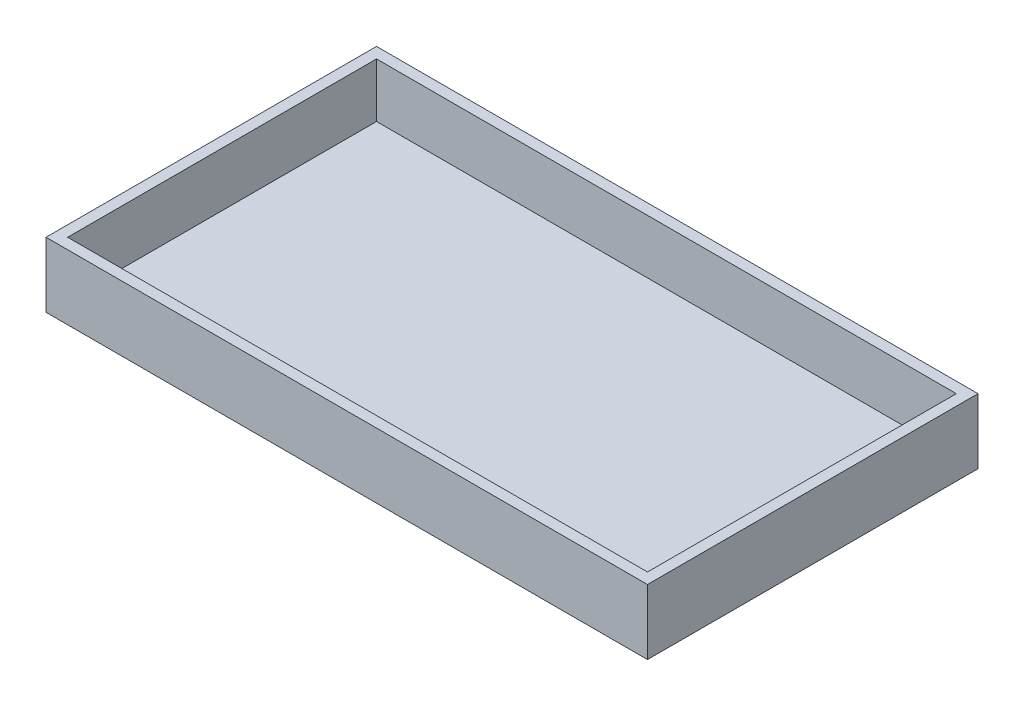
ISO-10303-21;
HEADER;
FILE_DESCRIPTION(('STEP AP214'),'2;1');
FILE_NAME('part.step','',(''),(''),'','','');
FILE_SCHEMA(('AUTOMOTIVE_DESIGN { 1 0 10303 214 1 1 1 1 }'));
ENDSEC;
DATA;
#1=APPLICATION_CONTEXT('core data for automotive mechanical design processes');
#2=APPLICATION_PROTOCOL_DEFINITION('international standard','automotive_design',2000,#1);
#3=PRODUCT_CONTEXT('',#1,'mechanical');
#4=PRODUCT('Part','Part','',(#3));
#5=PRODUCT_RELATED_PRODUCT_CATEGORY('part','',(#4));
#6=PRODUCT_DEFINITION_FORMATION('','',#4);
#7=PRODUCT_DEFINITION_CONTEXT('part definition',#1,'design');
#8=PRODUCT_DEFINITION('design','',#6,#7);
#9=PRODUCT_DEFINITION_SHAPE('','',#8);
#10=(LENGTH_UNIT() NAMED_UNIT(*) SI_UNIT(.MILLI.,.METRE.));
#11=(NAMED_UNIT(*) PLANE_ANGLE_UNIT() SI_UNIT($,.RADIAN.));
#12=(NAMED_UNIT(*) SI_UNIT($,.STERADIAN.) SOLID_ANGLE_UNIT());
#13=UNCERTAINTY_MEASURE_WITH_UNIT(LENGTH_MEASURE(1.E-05),#10,'distance_accuracy_value','');
#14=(GEOMETRIC_REPRESENTATION_CONTEXT(3) GLOBAL_UNCERTAINTY_ASSIGNED_CONTEXT((#13)) GLOBAL_UNIT_ASSIGNED_CONTEXT((#10,
#11,#12)) REPRESENTATION_CONTEXT('',''));
#15=CARTESIAN_POINT('',(0.,0.,0.));
#16=DIRECTION('',(0.,0.,1.));
#17=DIRECTION('',(1.,0.,0.));
#18=AXIS2_PLACEMENT_3D('',#15,#16,#17);
#19=CARTESIAN_POINT('',(-2.,-10.,0.));
#20=DIRECTION('',(-1.,0.,0.));
#21=DIRECTION('',(0.,0.,1.));
#22=AXIS2_PLACEMENT_3D('',#19,#20,#21);
#23=PLANE('',#22);
#24=DIRECTION('',(0.,0.,1.));
#25=VECTOR('',#24,1.);
#26=CARTESIAN_POINT('',(-2.,0.,0.));
#27=LINE('',#26,#25);
#28=CARTESIAN_POINT('',(-2.00000000000001,0.,-59.));
#29=VERTEX_POINT('',#28);
#30=CARTESIAN_POINT('',(-2.,0.,2.));
#31=VERTEX_POINT('',#30);
#32=EDGE_CURVE('E176',#29,#31,#27,.T.);
#33=ORIENTED_EDGE('',*,*,#32,.F.);
#34=DIRECTION('',(0.,1.,0.));
#35=VECTOR('',#34,1.);
#36=CARTESIAN_POINT('',(-2.00000000000001,-10.,-59.));
#37=LINE('',#36,#35);
#38=CARTESIAN_POINT('',(-2.00000000000001,-12.,-59.));
#39=VERTEX_POINT('',#38);
#40=EDGE_CURVE('E12',#39,#29,#37,.T.);
#41=ORIENTED_EDGE('',*,*,#40,.F.);
#42=DIRECTION('',(0.,0.,-1.));
#43=VECTOR('',#42,1.);
#44=CARTESIAN_POINT('',(-2.00000000000001,-12.,-59.));
#45=LINE('',#44,#43);
#46=CARTESIAN_POINT('',(-2.,-12.,2.));
#47=VERTEX_POINT('',#46);
#48=EDGE_CURVE('E143',#47,#39,#45,.T.);
#49=ORIENTED_EDGE('',*,*,#48,.F.);
#50=DIRECTION('',(0.,1.,0.));
#51=VECTOR('',#50,1.);
#52=CARTESIAN_POINT('',(-2.,-10.,2.));
#53=LINE('',#52,#51);
#54=EDGE_CURVE('E64',#47,#31,#53,.T.);
#55=ORIENTED_EDGE('',*,*,#54,.T.);
#56=EDGE_LOOP('',(#33,#41,#49,#55));
#57=FACE_BOUND('',#56,.T.);
#58=ADVANCED_FACE('F61',(#57),#23,.T.);
#59=CARTESIAN_POINT('',(0.,-10.,-59.));
#60=DIRECTION('',(0.,0.,-1.));
#61=DIRECTION('',(-1.,0.,0.));
#62=AXIS2_PLACEMENT_3D('',#59,#60,#61);
#63=PLANE('',#62);
#64=DIRECTION('',(-1.,0.,0.));
#65=VECTOR('',#64,1.);
#66=CARTESIAN_POINT('',(0.,0.,-59.));
#67=LINE('',#66,#65);
#68=CARTESIAN_POINT('',(109.,0.,-59.));
#69=VERTEX_POINT('',#68);
#70=EDGE_CURVE('E187',#69,#29,#67,.T.);
#71=ORIENTED_EDGE('',*,*,#70,.F.);
#72=DIRECTION('',(0.,1.,0.));
#73=VECTOR('',#72,1.);
#74=CARTESIAN_POINT('',(109.,-10.,-59.));
#75=LINE('',#74,#73);
#76=CARTESIAN_POINT('',(109.,-12.,-59.));
#77=VERTEX_POINT('',#76);
#78=EDGE_CURVE('E69',#77,#69,#75,.T.);
#79=ORIENTED_EDGE('',*,*,#78,.F.);
#80=DIRECTION('',(1.,0.,0.));
#81=VECTOR('',#80,1.);
#82=CARTESIAN_POINT('',(109.,-12.,-59.));
#83=LINE('',#82,#81);
#84=EDGE_CURVE('E148',#39,#77,#83,.T.);
#85=ORIENTED_EDGE('',*,*,#84,.F.);
#86=ORIENTED_EDGE('',*,*,#40,.T.);
#87=EDGE_LOOP('',(#71,#79,#85,#86));
#88=FACE_BOUND('',#87,.T.);
#89=ADVANCED_FACE('F194',(#88),#63,.T.);
#90=CARTESIAN_POINT('',(109.,-10.,0.));
#91=DIRECTION('',(1.,0.,0.));
#92=DIRECTION('',(0.,0.,-1.));
#93=AXIS2_PLACEMENT_3D('',#90,#91,#92);
#94=PLANE('',#93);
#95=DIRECTION('',(0.,0.,-1.));
#96=VECTOR('',#95,1.);
#97=CARTESIAN_POINT('',(109.,0.,0.));
#98=LINE('',#97,#96);
#99=CARTESIAN_POINT('',(109.,0.,2.));
#100=VERTEX_POINT('',#99);
#101=EDGE_CURVE('E133',#100,#69,#98,.T.);
#102=ORIENTED_EDGE('',*,*,#101,.F.);
#103=DIRECTION('',(0.,1.,0.));
#104=VECTOR('',#103,1.);
#105=CARTESIAN_POINT('',(109.,-10.,2.));
#106=LINE('',#105,#104);
#107=CARTESIAN_POINT('',(109.,-12.,2.));
#108=VERTEX_POINT('',#107);
#109=EDGE_CURVE('E127',#108,#100,#106,.T.);
#110=ORIENTED_EDGE('',*,*,#109,.F.);
#111=DIRECTION('',(0.,0.,1.));
#112=VECTOR('',#111,1.);
#113=CARTESIAN_POINT('',(109.,-12.,2.));
#114=LINE('',#113,#112);
#115=EDGE_CURVE('E131',#77,#108,#114,.T.);
#116=ORIENTED_EDGE('',*,*,#115,.F.);
#117=ORIENTED_EDGE('',*,*,#78,.T.);
#118=EDGE_LOOP('',(#102,#110,#116,#117));
#119=FACE_BOUND('',#118,.T.);
#120=ADVANCED_FACE('F129',(#119),#94,.T.);
#121=CARTESIAN_POINT('',(0.,-10.,2.));
#122=DIRECTION('',(0.,0.,1.));
#123=DIRECTION('',(1.,0.,0.));
#124=AXIS2_PLACEMENT_3D('',#121,#122,#123);
#125=PLANE('',#124);
#126=DIRECTION('',(1.,0.,0.));
#127=VECTOR('',#126,1.);
#128=CARTESIAN_POINT('',(0.,0.,2.));
#129=LINE('',#128,#127);
#130=EDGE_CURVE('E184',#31,#100,#129,.T.);
#131=ORIENTED_EDGE('',*,*,#130,.F.);
#132=ORIENTED_EDGE('',*,*,#54,.F.);
#133=DIRECTION('',(-1.,0.,0.));
#134=VECTOR('',#133,1.);
#135=CARTESIAN_POINT('',(-2.,-12.,2.));
#136=LINE('',#135,#134);
#137=EDGE_CURVE('E138',#108,#47,#136,.T.);
#138=ORIENTED_EDGE('',*,*,#137,.F.);
#139=ORIENTED_EDGE('',*,*,#109,.T.);
#140=EDGE_LOOP('',(#131,#132,#138,#139));
#141=FACE_BOUND('',#140,.T.);
#142=ADVANCED_FACE('F139',(#141),#125,.T.);
#143=CARTESIAN_POINT('',(0.,0.,0.));
#144=DIRECTION('',(0.,1.,0.));
#145=DIRECTION('',(0.,0.,1.));
#146=AXIS2_PLACEMENT_3D('',#143,#144,#145);
#147=PLANE('',#146);
#148=DIRECTION('',(0.,0.,1.));
#149=VECTOR('',#148,1.);
#150=CARTESIAN_POINT('',(0.,0.,0.));
#151=LINE('',#150,#149);
#152=CARTESIAN_POINT('',(0.,0.,-57.));
#153=VERTEX_POINT('',#152);
#154=CARTESIAN_POINT('',(0.,0.,0.));
#155=VERTEX_POINT('',#154);
#156=EDGE_CURVE('E85',#153,#155,#151,.T.);
#157=ORIENTED_EDGE('',*,*,#156,.F.);
#158=DIRECTION('',(-1.,0.,0.));
#159=VECTOR('',#158,1.);
#160=CARTESIAN_POINT('',(0.,0.,-57.));
#161=LINE('',#160,#159);
#162=CARTESIAN_POINT('',(107.,0.,-57.));
#163=VERTEX_POINT('',#162);
#164=EDGE_CURVE('E157',#163,#153,#161,.T.);
#165=ORIENTED_EDGE('',*,*,#164,.F.);
#166=DIRECTION('',(0.,0.,-1.));
#167=VECTOR('',#166,1.);
#168=CARTESIAN_POINT('',(107.,0.,0.));
#169=LINE('',#168,#167);
#170=CARTESIAN_POINT('',(107.,0.,0.));
#171=VERTEX_POINT('',#170);
#172=EDGE_CURVE('E169',#171,#163,#169,.T.);
#173=ORIENTED_EDGE('',*,*,#172,.F.);
#174=DIRECTION('',(1.,0.,0.));
#175=VECTOR('',#174,1.);
#176=CARTESIAN_POINT('',(0.,0.,0.));
#177=LINE('',#176,#175);
#178=EDGE_CURVE('E166',#155,#171,#177,.T.);
#179=ORIENTED_EDGE('',*,*,#178,.F.);
#180=EDGE_LOOP('',(#157,#165,#173,#179));
#181=FACE_BOUND('',#180,.T.);
#182=ORIENTED_EDGE('',*,*,#32,.T.);
#183=ORIENTED_EDGE('',*,*,#130,.T.);
#184=ORIENTED_EDGE('',*,*,#101,.T.);
#185=ORIENTED_EDGE('',*,*,#70,.T.);
#186=EDGE_LOOP('',(#182,#183,#184,#185));
#187=FACE_BOUND('',#186,.T.);
#188=ADVANCED_FACE('F193',(#181,#187),#147,.T.);
#189=CARTESIAN_POINT('',(0.,-10.,0.));
#190=DIRECTION('',(-1.,0.,0.));
#191=DIRECTION('',(0.,0.,1.));
#192=AXIS2_PLACEMENT_3D('',#189,#190,#191);
#193=PLANE('',#192);
#194=ORIENTED_EDGE('',*,*,#156,.T.);
#195=DIRECTION('',(0.,1.,0.));
#196=VECTOR('',#195,1.);
#197=CARTESIAN_POINT('',(0.,-10.,0.));
#198=LINE('',#197,#196);
#199=CARTESIAN_POINT('',(0.,-10.,0.));
#200=VERTEX_POINT('',#199);
#201=EDGE_CURVE('E164',#200,#155,#198,.T.);
#202=ORIENTED_EDGE('',*,*,#201,.F.);
#203=DIRECTION('',(0.,0.,1.));
#204=VECTOR('',#203,1.);
#205=CARTESIAN_POINT('',(0.,-10.,0.));
#206=LINE('',#205,#204);
#207=CARTESIAN_POINT('',(0.,-10.,-57.));
#208=VERTEX_POINT('',#207);
#209=EDGE_CURVE('E153',#208,#200,#206,.T.);
#210=ORIENTED_EDGE('',*,*,#209,.F.);
#211=DIRECTION('',(0.,1.,0.));
#212=VECTOR('',#211,1.);
#213=CARTESIAN_POINT('',(0.,-10.,-57.));
#214=LINE('',#213,#212);
#215=EDGE_CURVE('E174',#208,#153,#214,.T.);
#216=ORIENTED_EDGE('',*,*,#215,.T.);
#217=EDGE_LOOP('',(#194,#202,#210,#216));
#218=FACE_BOUND('',#217,.T.);
#219=ADVANCED_FACE('F212',(#218),#193,.F.);
#220=CARTESIAN_POINT('',(0.,-10.,-57.));
#221=DIRECTION('',(0.,0.,-1.));
#222=DIRECTION('',(-1.,0.,0.));
#223=AXIS2_PLACEMENT_3D('',#220,#221,#222);
#224=PLANE('',#223);
#225=ORIENTED_EDGE('',*,*,#164,.T.);
#226=ORIENTED_EDGE('',*,*,#215,.F.);
#227=DIRECTION('',(-1.,0.,0.));
#228=VECTOR('',#227,1.);
#229=CARTESIAN_POINT('',(0.,-10.,-57.));
#230=LINE('',#229,#228);
#231=CARTESIAN_POINT('',(107.,-10.,-57.));
#232=VERTEX_POINT('',#231);
#233=EDGE_CURVE('E161',#232,#208,#230,.T.);
#234=ORIENTED_EDGE('',*,*,#233,.F.);
#235=DIRECTION('',(0.,1.,0.));
#236=VECTOR('',#235,1.);
#237=CARTESIAN_POINT('',(107.,-10.,-57.));
#238=LINE('',#237,#236);
#239=EDGE_CURVE('E177',#232,#163,#238,.T.);
#240=ORIENTED_EDGE('',*,*,#239,.T.);
#241=EDGE_LOOP('',(#225,#226,#234,#240));
#242=FACE_BOUND('',#241,.T.);
#243=ADVANCED_FACE('F217',(#242),#224,.F.);
#244=CARTESIAN_POINT('',(107.,-10.,0.));
#245=DIRECTION('',(1.,0.,0.));
#246=DIRECTION('',(0.,0.,-1.));
#247=AXIS2_PLACEMENT_3D('',#244,#245,#246);
#248=PLANE('',#247);
#249=ORIENTED_EDGE('',*,*,#172,.T.);
#250=ORIENTED_EDGE('',*,*,#239,.F.);
#251=DIRECTION('',(0.,0.,-1.));
#252=VECTOR('',#251,1.);
#253=CARTESIAN_POINT('',(107.,-10.,0.));
#254=LINE('',#253,#252);
#255=CARTESIAN_POINT('',(107.,-10.,0.));
#256=VERTEX_POINT('',#255);
#257=EDGE_CURVE('E77',#256,#232,#254,.T.);
#258=ORIENTED_EDGE('',*,*,#257,.F.);
#259=DIRECTION('',(0.,1.,0.));
#260=VECTOR('',#259,1.);
#261=CARTESIAN_POINT('',(107.,-10.,0.));
#262=LINE('',#261,#260);
#263=EDGE_CURVE('E179',#256,#171,#262,.T.);
#264=ORIENTED_EDGE('',*,*,#263,.T.);
#265=EDGE_LOOP('',(#249,#250,#258,#264));
#266=FACE_BOUND('',#265,.T.);
#267=ADVANCED_FACE('F228',(#266),#248,.F.);
#268=CARTESIAN_POINT('',(0.,-10.,0.));
#269=DIRECTION('',(0.,0.,1.));
#270=DIRECTION('',(1.,0.,0.));
#271=AXIS2_PLACEMENT_3D('',#268,#269,#270);
#272=PLANE('',#271);
#273=ORIENTED_EDGE('',*,*,#178,.T.);
#274=ORIENTED_EDGE('',*,*,#263,.F.);
#275=DIRECTION('',(1.,0.,0.));
#276=VECTOR('',#275,1.);
#277=CARTESIAN_POINT('',(0.,-10.,0.));
#278=LINE('',#277,#276);
#279=EDGE_CURVE('E156',#200,#256,#278,.T.);
#280=ORIENTED_EDGE('',*,*,#279,.F.);
#281=ORIENTED_EDGE('',*,*,#201,.T.);
#282=EDGE_LOOP('',(#273,#274,#280,#281));
#283=FACE_BOUND('',#282,.T.);
#284=ADVANCED_FACE('F222',(#283),#272,.F.);
#285=CARTESIAN_POINT('',(0.,-10.,0.));
#286=DIRECTION('',(0.,1.,0.));
#287=DIRECTION('',(0.,0.,1.));
#288=AXIS2_PLACEMENT_3D('',#285,#286,#287);
#289=PLANE('',#288);
#290=ORIENTED_EDGE('',*,*,#257,.T.);
#291=ORIENTED_EDGE('',*,*,#233,.T.);
#292=ORIENTED_EDGE('',*,*,#209,.T.);
#293=ORIENTED_EDGE('',*,*,#279,.T.);
#294=EDGE_LOOP('',(#290,#291,#292,#293));
#295=FACE_BOUND('',#294,.T.);
#296=ADVANCED_FACE('F226',(#295),#289,.T.);
#297=CARTESIAN_POINT('',(0.,-12.,0.));
#298=DIRECTION('',(0.,1.,0.));
#299=DIRECTION('',(0.,0.,1.));
#300=AXIS2_PLACEMENT_3D('',#297,#298,#299);
#301=PLANE('',#300);
#302=ORIENTED_EDGE('',*,*,#115,.T.);
#303=ORIENTED_EDGE('',*,*,#137,.T.);
#304=ORIENTED_EDGE('',*,*,#48,.T.);
#305=ORIENTED_EDGE('',*,*,#84,.T.);
#306=EDGE_LOOP('',(#302,#303,#304,#305));
#307=FACE_BOUND('',#306,.T.);
#308=ADVANCED_FACE('F146',(#307),#301,.F.);
#309=CLOSED_SHELL('',(#58,#89,#120,#142,#188,#219,#243,#267,#284,#296,#308));
#310=MANIFOLD_SOLID_BREP('B2',#309);
#311=ADVANCED_BREP_SHAPE_REPRESENTATION('',(#18,#310),#14);
#312=SHAPE_DEFINITION_REPRESENTATION(#9,#311);
ENDSEC;
END-ISO-10303-21;
